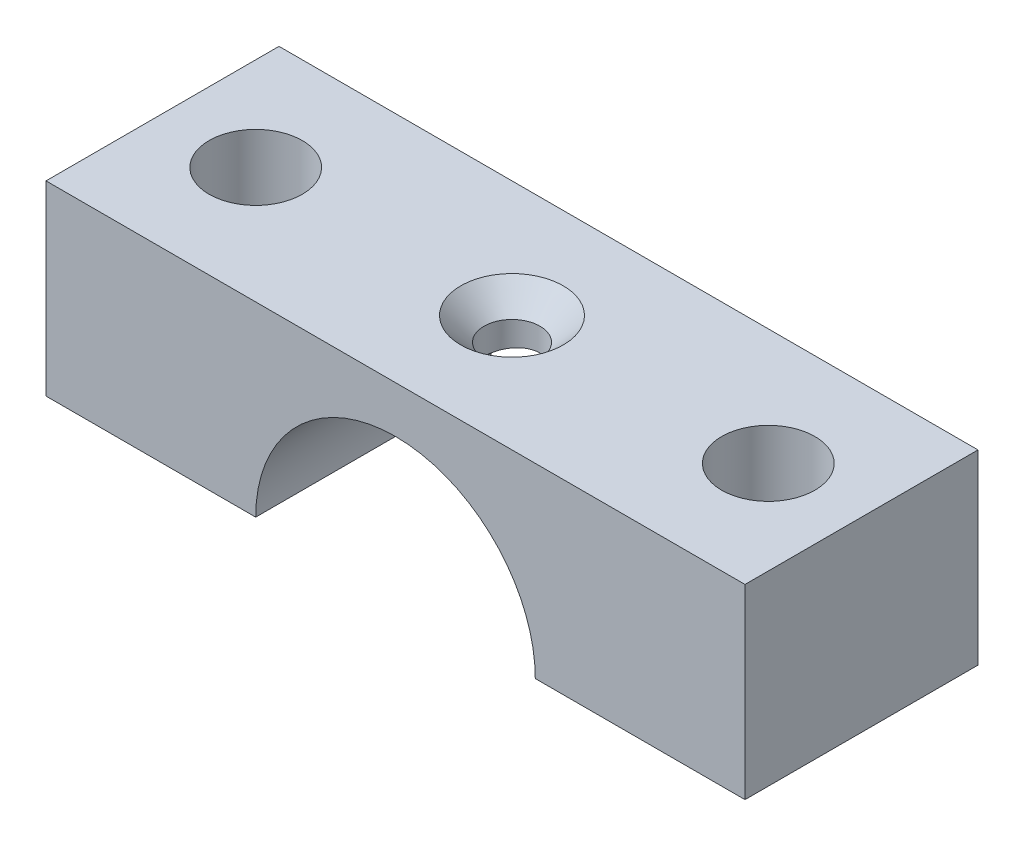
ISO-10303-21;
HEADER;
FILE_DESCRIPTION(('STEP AP214'),'2;1');
FILE_NAME('part.step','',(''),(''),'','','');
FILE_SCHEMA(('AUTOMOTIVE_DESIGN { 1 0 10303 214 1 1 1 1 }'));
ENDSEC;
DATA;
#1=APPLICATION_CONTEXT('core data for automotive mechanical design processes');
#2=APPLICATION_PROTOCOL_DEFINITION('international standard','automotive_design',2000,#1);
#3=PRODUCT_CONTEXT('',#1,'mechanical');
#4=PRODUCT('Part','Part','',(#3));
#5=PRODUCT_RELATED_PRODUCT_CATEGORY('part','',(#4));
#6=PRODUCT_DEFINITION_FORMATION('','',#4);
#7=PRODUCT_DEFINITION_CONTEXT('part definition',#1,'design');
#8=PRODUCT_DEFINITION('design','',#6,#7);
#9=PRODUCT_DEFINITION_SHAPE('','',#8);
#10=(LENGTH_UNIT() NAMED_UNIT(*) SI_UNIT(.MILLI.,.METRE.));
#11=(NAMED_UNIT(*) PLANE_ANGLE_UNIT() SI_UNIT($,.RADIAN.));
#12=(NAMED_UNIT(*) SI_UNIT($,.STERADIAN.) SOLID_ANGLE_UNIT());
#13=UNCERTAINTY_MEASURE_WITH_UNIT(LENGTH_MEASURE(1.E-05),#10,'distance_accuracy_value','');
#14=(GEOMETRIC_REPRESENTATION_CONTEXT(3) GLOBAL_UNCERTAINTY_ASSIGNED_CONTEXT((#13)) GLOBAL_UNIT_ASSIGNED_CONTEXT((#10,
#11,#12)) REPRESENTATION_CONTEXT('',''));
#15=CARTESIAN_POINT('',(0.,0.,0.));
#16=DIRECTION('',(0.,0.,1.));
#17=DIRECTION('',(1.,0.,0.));
#18=AXIS2_PLACEMENT_3D('',#15,#16,#17);
#19=CARTESIAN_POINT('',(0.,0.,5.));
#20=DIRECTION('',(0.,0.,-1.));
#21=DIRECTION('',(-1.,0.,0.));
#22=AXIS2_PLACEMENT_3D('',#19,#20,#21);
#23=CYLINDRICAL_SURFACE('',#22,6.);
#24=CARTESIAN_POINT('',(0.,6.,1.2));
#25=CARTESIAN_POINT('',(0.0666922881511597,5.99999877097045,1.19999754660198));
#26=CARTESIAN_POINT('',(0.133415592241827,5.99887662213877,1.19442138843882));
#27=CARTESIAN_POINT('',(0.264976209226823,5.99450838747878,1.1722817998617));
#28=CARTESIAN_POINT('',(0.329811981049627,5.99126061432223,1.15570964063819));
#29=CARTESIAN_POINT('',(0.455676366315975,5.98300379133944,1.11211047165505));
#30=CARTESIAN_POINT('',(0.51670856151976,5.97799642892062,1.08509347578637));
#31=CARTESIAN_POINT('',(0.63336958663707,5.96676477642377,1.02140130298645));
#32=CARTESIAN_POINT('',(0.688998738090973,5.96054055882848,0.984726701271352));
#33=CARTESIAN_POINT('',(0.794032172777837,5.94746598395964,0.902233806850278));
#34=CARTESIAN_POINT('',(0.843352741390228,5.94060894605217,0.856309973530556));
#35=CARTESIAN_POINT('',(0.933644107929632,5.92709016543106,0.756849100329956));
#36=CARTESIAN_POINT('',(0.974614253724508,5.92042843800509,0.703311466397857));
#37=CARTESIAN_POINT('',(1.04739810401714,5.90798930175138,0.589540568385749));
#38=CARTESIAN_POINT('',(1.07912512663904,5.90222048837935,0.529250827444368));
#39=CARTESIAN_POINT('',(1.13196679989637,5.89231521670101,0.404061817195104));
#40=CARTESIAN_POINT('',(1.15308249892468,5.88817859714354,0.339163003984385));
#41=CARTESIAN_POINT('',(1.18383035986179,5.88207366302646,0.207498763310499));
#42=CARTESIAN_POINT('',(1.19360939755053,5.88007764128625,0.140768947029328));
#43=CARTESIAN_POINT('',(1.20186255327134,5.87839650072753,0.00658821436278886));
#44=CARTESIAN_POINT('',(1.2003378272562,5.87871114561409,-0.0608626275841745));
#45=CARTESIAN_POINT('',(1.18614548772218,5.88159061377822,-0.193496145625204));
#46=CARTESIAN_POINT('',(1.17364624829269,5.88412143430516,-0.258697686752777));
#47=CARTESIAN_POINT('',(1.13812546154766,5.89109455392001,-0.386059291995602));
#48=CARTESIAN_POINT('',(1.11510341172082,5.89553694429335,-0.448219210702809));
#49=CARTESIAN_POINT('',(1.05902974040966,5.9058674220049,-0.568218314044319));
#50=CARTESIAN_POINT('',(1.02591138147854,5.91176507776445,-0.626025455483006));
#51=CARTESIAN_POINT('',(0.950632289487213,5.92433542527674,-0.735325019967376));
#52=CARTESIAN_POINT('',(0.908470517228193,5.93100820606039,-0.786816716221388));
#53=CARTESIAN_POINT('',(0.815399921472699,5.94452425489754,-0.882995282948323));
#54=CARTESIAN_POINT('',(0.764347393454932,5.95136843053086,-0.927543081430956));
#55=CARTESIAN_POINT('',(0.65542202887441,5.9643461845729,-1.00746461556147));
#56=CARTESIAN_POINT('',(0.597549104855265,5.97047975386768,-1.04283823355229));
#57=CARTESIAN_POINT('',(0.476471264254703,5.98136028193065,-1.10343301107117));
#58=CARTESIAN_POINT('',(0.413258183502359,5.98610506617926,-1.12863827237344));
#59=CARTESIAN_POINT('',(0.283378771738397,5.9936569078543,-1.16803256884628));
#60=CARTESIAN_POINT('',(0.216712860086938,5.99646420000638,-1.18222293848835));
#61=CARTESIAN_POINT('',(0.0830152867525798,5.99979206240241,-1.19898774455313));
#62=CARTESIAN_POINT('',(0.0160083939906909,6.00035009582964,-1.20175250344832));
#63=CARTESIAN_POINT('',(-0.117509921031257,5.99922062316123,-1.19610016926938));
#64=CARTESIAN_POINT('',(-0.184021370932552,5.99753324329735,-1.18768370477688));
#65=CARTESIAN_POINT('',(-0.314046791935849,5.99212598409621,-1.16006595174725));
#66=CARTESIAN_POINT('',(-0.377582338007884,5.98842451685048,-1.14096231780251));
#67=CARTESIAN_POINT('',(-0.5005483529996,5.97940262473239,-1.09261922081303));
#68=CARTESIAN_POINT('',(-0.559978513965047,5.97408207857072,-1.0633789983878));
#69=CARTESIAN_POINT('',(-0.673849408423461,5.96231893839953,-0.995181011218423));
#70=CARTESIAN_POINT('',(-0.728220152102625,5.95586340524462,-0.956108662753264));
#71=CARTESIAN_POINT('',(-0.829701622943047,5.94257681795859,-0.869508970551261));
#72=CARTESIAN_POINT('',(-0.876811570716914,5.93574572362066,-0.821980720320158));
#73=CARTESIAN_POINT('',(-0.96316870892901,5.92235164268358,-0.71895197773065));
#74=CARTESIAN_POINT('',(-1.00228524293839,5.91579432279965,-0.663341106934394));
#75=CARTESIAN_POINT('',(-1.07062250406145,5.90381030155433,-0.546226366371984));
#76=CARTESIAN_POINT('',(-1.09984362710748,5.89838355496011,-0.484722732511736));
#77=CARTESIAN_POINT('',(-1.14738220989835,5.8893208870126,-0.357878104620541));
#78=CARTESIAN_POINT('',(-1.16575619974926,5.88567569846624,-0.292558990547616));
#79=CARTESIAN_POINT('',(-1.19125038195263,5.8805692415043,-0.159679855810914));
#80=CARTESIAN_POINT('',(-1.19837204187013,5.87910768829334,-0.0921201285487826));
#81=CARTESIAN_POINT('',(-1.20110509304096,5.87854979557655,0.0420106374531827));
#82=CARTESIAN_POINT('',(-1.19692294568507,5.87941103027161,0.108577378712411));
#83=CARTESIAN_POINT('',(-1.17762276492007,5.88330688181537,0.240037979886032));
#84=CARTESIAN_POINT('',(-1.16250481935516,5.88634148120603,0.304931853233766));
#85=CARTESIAN_POINT('',(-1.12185428219874,5.8942231706299,0.431073253488654));
#86=CARTESIAN_POINT('',(-1.09634700806081,5.89906585222597,0.492329232602898));
#87=CARTESIAN_POINT('',(-1.03566557352192,5.91002057969004,0.609724464881329));
#88=CARTESIAN_POINT('',(-1.00049060252986,5.91613273198673,0.665863288470164));
#89=CARTESIAN_POINT('',(-0.920767097743695,5.9290675262787,0.772458686580376));
#90=CARTESIAN_POINT('',(-0.876069464682215,5.93590047491639,0.822802518321114));
#91=CARTESIAN_POINT('',(-0.778877242815767,5.94943298246346,0.915343446635004));
#92=CARTESIAN_POINT('',(-0.726380864584001,5.95613251035821,0.957538668380726));
#93=CARTESIAN_POINT('',(-0.614421154905894,5.96872598865566,1.03300157273574));
#94=CARTESIAN_POINT('',(-0.5548906613158,5.97461077463095,1.06617120393603));
#95=CARTESIAN_POINT('',(-0.430999633128878,5.98482150102,1.12198334711591));
#96=CARTESIAN_POINT('',(-0.36664351303575,5.98914884566339,1.14463534743899));
#97=CARTESIAN_POINT('',(-0.251785786708535,5.99491647114445,1.17438233765366));
#98=CARTESIAN_POINT('',(-0.201937996816541,5.99681163790142,1.18397183244931));
#99=CARTESIAN_POINT('',(-0.10139943025208,5.99935384967871,1.19678149483004));
#100=CARTESIAN_POINT('',(-0.0507086804983425,6.00000093447786,1.20000186541172));
#101=CARTESIAN_POINT('',(0.,6.,1.2));
#102=B_SPLINE_CURVE_WITH_KNOTS('',3,(#24,#25,#26,#27,#28,#29,#30,#31,#32,#33,#34,#35,#36,#37,
#38,#39,#40,#41,#42,#43,#44,#45,#46,#47,#48,#49,#50,#51,#52,#53,#54,#55,#56,#57,#58,#59,#60,#61,
#62,#63,#64,#65,#66,#67,#68,#69,#70,#71,#72,#73,#74,#75,#76,#77,#78,#79,#80,#81,#82,#83,#84,#85,
#86,#87,#88,#89,#90,#91,#92,#93,#94,#95,#96,#97,#98,#99,#100,#101),.UNSPECIFIED.,.T.,.F.,(4,2,2,
2,2,2,2,2,2,2,2,2,2,2,2,2,2,2,2,2,2,2,2,2,2,2,2,2,2,2,2,2,2,2,2,2,2,2,4),(0.,0.19989135679351,
0.399941580829587,0.599800482300409,0.799647482677035,1.00191920413462,1.20420671609684,
1.40833434007107,1.61244179238237,1.81387422124305,2.0152860513747,2.21366072407534,
2.41204487104475,2.61176988244311,2.81151785699604,3.01485902989621,3.21820281047784,
3.42186329824828,3.62549910837643,3.82572882811518,4.02594729189441,4.22436544740868,
4.42279847059226,4.6236607924003,4.82454466015115,5.0284875429507,5.23242226468159,
5.43528457239267,5.63812041996497,5.83727667081241,6.03643132191129,6.23510353503731,
6.43379241098239,6.63585691486971,6.83796785439516,7.04219396010763,7.24623546621021,
7.39822530347872,7.55021029645194),.UNSPECIFIED.);
#103=CARTESIAN_POINT('',(0.,6.,1.2));
#104=VERTEX_POINT('',#103);
#105=EDGE_CURVE('E41',#104,#104,#102,.T.);
#106=ORIENTED_EDGE('',*,*,#105,.T.);
#107=EDGE_LOOP('',(#106));
#108=FACE_BOUND('',#107,.T.);
#109=CARTESIAN_POINT('',(0.,0.,-5.));
#110=DIRECTION('',(0.,0.,-1.));
#111=DIRECTION('',(-1.,0.,0.));
#112=AXIS2_PLACEMENT_3D('',#109,#110,#111);
#113=CIRCLE('',#112,6.);
#114=CARTESIAN_POINT('',(-6.,0.,-5.));
#115=VERTEX_POINT('',#114);
#116=CARTESIAN_POINT('',(6.,0.,-5.));
#117=VERTEX_POINT('',#116);
#118=EDGE_CURVE('E127',#115,#117,#113,.T.);
#119=ORIENTED_EDGE('',*,*,#118,.T.);
#120=DIRECTION('',(0.,0.,-1.));
#121=VECTOR('',#120,1.);
#122=CARTESIAN_POINT('',(6.,0.,5.));
#123=LINE('',#122,#121);
#124=CARTESIAN_POINT('',(6.,0.,5.));
#125=VERTEX_POINT('',#124);
#126=EDGE_CURVE('E11',#125,#117,#123,.T.);
#127=ORIENTED_EDGE('',*,*,#126,.F.);
#128=CARTESIAN_POINT('',(0.,0.,5.));
#129=DIRECTION('',(0.,0.,-1.));
#130=DIRECTION('',(-1.,0.,0.));
#131=AXIS2_PLACEMENT_3D('',#128,#129,#130);
#132=CIRCLE('',#131,6.);
#133=CARTESIAN_POINT('',(-6.,0.,5.));
#134=VERTEX_POINT('',#133);
#135=EDGE_CURVE('E138',#134,#125,#132,.T.);
#136=ORIENTED_EDGE('',*,*,#135,.F.);
#137=DIRECTION('',(0.,0.,-1.));
#138=VECTOR('',#137,1.);
#139=CARTESIAN_POINT('',(-6.,0.,5.));
#140=LINE('',#139,#138);
#141=EDGE_CURVE('E123',#134,#115,#140,.T.);
#142=ORIENTED_EDGE('',*,*,#141,.T.);
#143=EDGE_LOOP('',(#119,#127,#136,#142));
#144=FACE_BOUND('',#143,.T.);
#145=ADVANCED_FACE('F37',(#108,#144),#23,.F.);
#146=CARTESIAN_POINT('',(15.,0.,5.));
#147=DIRECTION('',(0.,1.,0.));
#148=DIRECTION('',(-1.,0.,0.));
#149=AXIS2_PLACEMENT_3D('',#146,#147,#148);
#150=PLANE('',#149);
#151=CARTESIAN_POINT('',(11.,0.,0.));
#152=DIRECTION('',(0.,1.,0.));
#153=DIRECTION('',(0.,0.,1.));
#154=AXIS2_PLACEMENT_3D('',#151,#152,#153);
#155=CIRCLE('',#154,2.);
#156=CARTESIAN_POINT('',(11.,0.,2.));
#157=VERTEX_POINT('',#156);
#158=EDGE_CURVE('E177',#157,#157,#155,.T.);
#159=ORIENTED_EDGE('',*,*,#158,.T.);
#160=EDGE_LOOP('',(#159));
#161=FACE_BOUND('',#160,.T.);
#162=DIRECTION('',(1.,0.,0.));
#163=VECTOR('',#162,1.);
#164=CARTESIAN_POINT('',(15.,0.,-5.));
#165=LINE('',#164,#163);
#166=CARTESIAN_POINT('',(15.,0.,-5.));
#167=VERTEX_POINT('',#166);
#168=EDGE_CURVE('E130',#117,#167,#165,.T.);
#169=ORIENTED_EDGE('',*,*,#168,.T.);
#170=DIRECTION('',(0.,0.,-1.));
#171=VECTOR('',#170,1.);
#172=CARTESIAN_POINT('',(15.,0.,5.));
#173=LINE('',#172,#171);
#174=CARTESIAN_POINT('',(15.,0.,5.));
#175=VERTEX_POINT('',#174);
#176=EDGE_CURVE('E51',#175,#167,#173,.T.);
#177=ORIENTED_EDGE('',*,*,#176,.F.);
#178=DIRECTION('',(1.,0.,0.));
#179=VECTOR('',#178,1.);
#180=CARTESIAN_POINT('',(15.,0.,5.));
#181=LINE('',#180,#179);
#182=EDGE_CURVE('E96',#125,#175,#181,.T.);
#183=ORIENTED_EDGE('',*,*,#182,.F.);
#184=ORIENTED_EDGE('',*,*,#126,.T.);
#185=EDGE_LOOP('',(#169,#177,#183,#184));
#186=FACE_BOUND('',#185,.T.);
#187=ADVANCED_FACE('F165',(#161,#186),#150,.F.);
#188=CARTESIAN_POINT('',(15.,8.,5.));
#189=DIRECTION('',(-1.,0.,0.));
#190=DIRECTION('',(0.,0.,1.));
#191=AXIS2_PLACEMENT_3D('',#188,#189,#190);
#192=PLANE('',#191);
#193=DIRECTION('',(0.,1.,0.));
#194=VECTOR('',#193,1.);
#195=CARTESIAN_POINT('',(15.,8.,-5.));
#196=LINE('',#195,#194);
#197=CARTESIAN_POINT('',(15.,8.,-5.));
#198=VERTEX_POINT('',#197);
#199=EDGE_CURVE('E133',#167,#198,#196,.T.);
#200=ORIENTED_EDGE('',*,*,#199,.T.);
#201=DIRECTION('',(0.,0.,-1.));
#202=VECTOR('',#201,1.);
#203=CARTESIAN_POINT('',(15.,8.,5.));
#204=LINE('',#203,#202);
#205=CARTESIAN_POINT('',(15.,8.,5.));
#206=VERTEX_POINT('',#205);
#207=EDGE_CURVE('E118',#206,#198,#204,.T.);
#208=ORIENTED_EDGE('',*,*,#207,.F.);
#209=DIRECTION('',(0.,1.,0.));
#210=VECTOR('',#209,1.);
#211=CARTESIAN_POINT('',(15.,8.,5.));
#212=LINE('',#211,#210);
#213=EDGE_CURVE('E109',#175,#206,#212,.T.);
#214=ORIENTED_EDGE('',*,*,#213,.F.);
#215=ORIENTED_EDGE('',*,*,#176,.T.);
#216=EDGE_LOOP('',(#200,#208,#214,#215));
#217=FACE_BOUND('',#216,.T.);
#218=ADVANCED_FACE('F145',(#217),#192,.F.);
#219=CARTESIAN_POINT('',(-15.,8.,5.));
#220=DIRECTION('',(0.,-1.,0.));
#221=DIRECTION('',(0.,0.,-1.));
#222=AXIS2_PLACEMENT_3D('',#219,#220,#221);
#223=PLANE('',#222);
#224=CARTESIAN_POINT('',(0.,8.,0.));
#225=DIRECTION('',(0.,1.,0.));
#226=DIRECTION('',(0.,0.,1.));
#227=AXIS2_PLACEMENT_3D('',#224,#225,#226);
#228=CIRCLE('',#227,2.2);
#229=CARTESIAN_POINT('',(0.,8.,2.2));
#230=VERTEX_POINT('',#229);
#231=EDGE_CURVE('E180',#230,#230,#228,.T.);
#232=ORIENTED_EDGE('',*,*,#231,.F.);
#233=EDGE_LOOP('',(#232));
#234=FACE_BOUND('',#233,.T.);
#235=CARTESIAN_POINT('',(-11.,8.,0.));
#236=DIRECTION('',(0.,1.,0.));
#237=DIRECTION('',(0.,0.,1.));
#238=AXIS2_PLACEMENT_3D('',#235,#236,#237);
#239=CIRCLE('',#238,2.);
#240=CARTESIAN_POINT('',(-11.,8.,2.));
#241=VERTEX_POINT('',#240);
#242=EDGE_CURVE('E188',#241,#241,#239,.T.);
#243=ORIENTED_EDGE('',*,*,#242,.F.);
#244=EDGE_LOOP('',(#243));
#245=FACE_BOUND('',#244,.T.);
#246=CARTESIAN_POINT('',(11.,8.,0.));
#247=DIRECTION('',(0.,1.,0.));
#248=DIRECTION('',(0.,0.,1.));
#249=AXIS2_PLACEMENT_3D('',#246,#247,#248);
#250=CIRCLE('',#249,2.);
#251=CARTESIAN_POINT('',(11.,8.,2.));
#252=VERTEX_POINT('',#251);
#253=EDGE_CURVE('E174',#252,#252,#250,.T.);
#254=ORIENTED_EDGE('',*,*,#253,.F.);
#255=EDGE_LOOP('',(#254));
#256=FACE_BOUND('',#255,.T.);
#257=DIRECTION('',(-1.,0.,0.));
#258=VECTOR('',#257,1.);
#259=CARTESIAN_POINT('',(-15.,8.,-5.));
#260=LINE('',#259,#258);
#261=CARTESIAN_POINT('',(-15.,8.,-5.));
#262=VERTEX_POINT('',#261);
#263=EDGE_CURVE('E117',#198,#262,#260,.T.);
#264=ORIENTED_EDGE('',*,*,#263,.T.);
#265=DIRECTION('',(0.,0.,-1.));
#266=VECTOR('',#265,1.);
#267=CARTESIAN_POINT('',(-15.,8.,5.));
#268=LINE('',#267,#266);
#269=CARTESIAN_POINT('',(-15.,8.,5.));
#270=VERTEX_POINT('',#269);
#271=EDGE_CURVE('E114',#270,#262,#268,.T.);
#272=ORIENTED_EDGE('',*,*,#271,.F.);
#273=DIRECTION('',(-1.,0.,0.));
#274=VECTOR('',#273,1.);
#275=CARTESIAN_POINT('',(-15.,8.,5.));
#276=LINE('',#275,#274);
#277=EDGE_CURVE('E103',#206,#270,#276,.T.);
#278=ORIENTED_EDGE('',*,*,#277,.F.);
#279=ORIENTED_EDGE('',*,*,#207,.T.);
#280=EDGE_LOOP('',(#264,#272,#278,#279));
#281=FACE_BOUND('',#280,.T.);
#282=ADVANCED_FACE('F115',(#234,#245,#256,#281),#223,.F.);
#283=CARTESIAN_POINT('',(-15.,0.,5.));
#284=DIRECTION('',(1.,0.,0.));
#285=DIRECTION('',(0.,0.,-1.));
#286=AXIS2_PLACEMENT_3D('',#283,#284,#285);
#287=PLANE('',#286);
#288=DIRECTION('',(0.,-1.,0.));
#289=VECTOR('',#288,1.);
#290=CARTESIAN_POINT('',(-15.,0.,-5.));
#291=LINE('',#290,#289);
#292=CARTESIAN_POINT('',(-15.,0.,-5.));
#293=VERTEX_POINT('',#292);
#294=EDGE_CURVE('E82',#262,#293,#291,.T.);
#295=ORIENTED_EDGE('',*,*,#294,.T.);
#296=DIRECTION('',(0.,0.,-1.));
#297=VECTOR('',#296,1.);
#298=CARTESIAN_POINT('',(-15.,0.,5.));
#299=LINE('',#298,#297);
#300=CARTESIAN_POINT('',(-15.,0.,5.));
#301=VERTEX_POINT('',#300);
#302=EDGE_CURVE('E119',#301,#293,#299,.T.);
#303=ORIENTED_EDGE('',*,*,#302,.F.);
#304=DIRECTION('',(0.,-1.,0.));
#305=VECTOR('',#304,1.);
#306=CARTESIAN_POINT('',(-15.,0.,5.));
#307=LINE('',#306,#305);
#308=EDGE_CURVE('E107',#270,#301,#307,.T.);
#309=ORIENTED_EDGE('',*,*,#308,.F.);
#310=ORIENTED_EDGE('',*,*,#271,.T.);
#311=EDGE_LOOP('',(#295,#303,#309,#310));
#312=FACE_BOUND('',#311,.T.);
#313=ADVANCED_FACE('F121',(#312),#287,.F.);
#314=CARTESIAN_POINT('',(-6.,0.,5.));
#315=DIRECTION('',(0.,1.,0.));
#316=DIRECTION('',(-1.,0.,0.));
#317=AXIS2_PLACEMENT_3D('',#314,#315,#316);
#318=PLANE('',#317);
#319=CARTESIAN_POINT('',(-11.,0.,0.));
#320=DIRECTION('',(0.,1.,0.));
#321=DIRECTION('',(0.,0.,1.));
#322=AXIS2_PLACEMENT_3D('',#319,#320,#321);
#323=CIRCLE('',#322,2.);
#324=CARTESIAN_POINT('',(-11.,0.,2.));
#325=VERTEX_POINT('',#324);
#326=EDGE_CURVE('E131',#325,#325,#323,.T.);
#327=ORIENTED_EDGE('',*,*,#326,.T.);
#328=EDGE_LOOP('',(#327));
#329=FACE_BOUND('',#328,.T.);
#330=DIRECTION('',(1.,0.,0.));
#331=VECTOR('',#330,1.);
#332=CARTESIAN_POINT('',(-6.,0.,-5.));
#333=LINE('',#332,#331);
#334=EDGE_CURVE('E88',#293,#115,#333,.T.);
#335=ORIENTED_EDGE('',*,*,#334,.T.);
#336=ORIENTED_EDGE('',*,*,#141,.F.);
#337=DIRECTION('',(1.,0.,0.));
#338=VECTOR('',#337,1.);
#339=CARTESIAN_POINT('',(-6.,0.,5.));
#340=LINE('',#339,#338);
#341=EDGE_CURVE('E59',#301,#134,#340,.T.);
#342=ORIENTED_EDGE('',*,*,#341,.F.);
#343=ORIENTED_EDGE('',*,*,#302,.T.);
#344=EDGE_LOOP('',(#335,#336,#342,#343));
#345=FACE_BOUND('',#344,.T.);
#346=ADVANCED_FACE('F152',(#329,#345),#318,.F.);
#347=CARTESIAN_POINT('',(0.,0.,5.));
#348=DIRECTION('',(0.,0.,-1.));
#349=DIRECTION('',(-1.,0.,0.));
#350=AXIS2_PLACEMENT_3D('',#347,#348,#349);
#351=PLANE('',#350);
#352=ORIENTED_EDGE('',*,*,#135,.T.);
#353=ORIENTED_EDGE('',*,*,#182,.T.);
#354=ORIENTED_EDGE('',*,*,#213,.T.);
#355=ORIENTED_EDGE('',*,*,#277,.T.);
#356=ORIENTED_EDGE('',*,*,#308,.T.);
#357=ORIENTED_EDGE('',*,*,#341,.T.);
#358=EDGE_LOOP('',(#352,#353,#354,#355,#356,#357));
#359=FACE_BOUND('',#358,.T.);
#360=ADVANCED_FACE('F105',(#359),#351,.F.);
#361=CARTESIAN_POINT('',(0.,0.,-5.));
#362=DIRECTION('',(0.,0.,-1.));
#363=DIRECTION('',(-1.,0.,0.));
#364=AXIS2_PLACEMENT_3D('',#361,#362,#363);
#365=PLANE('',#364);
#366=ORIENTED_EDGE('',*,*,#118,.F.);
#367=ORIENTED_EDGE('',*,*,#334,.F.);
#368=ORIENTED_EDGE('',*,*,#294,.F.);
#369=ORIENTED_EDGE('',*,*,#263,.F.);
#370=ORIENTED_EDGE('',*,*,#199,.F.);
#371=ORIENTED_EDGE('',*,*,#168,.F.);
#372=EDGE_LOOP('',(#366,#367,#368,#369,#370,#371));
#373=FACE_BOUND('',#372,.T.);
#374=ADVANCED_FACE('F148',(#373),#365,.T.);
#375=CARTESIAN_POINT('',(-11.,0.,0.));
#376=DIRECTION('',(0.,1.,0.));
#377=DIRECTION('',(0.,0.,1.));
#378=AXIS2_PLACEMENT_3D('',#375,#376,#377);
#379=CYLINDRICAL_SURFACE('',#378,2.);
#380=ORIENTED_EDGE('',*,*,#326,.F.);
#381=EDGE_LOOP('',(#380));
#382=FACE_BOUND('',#381,.T.);
#383=ORIENTED_EDGE('',*,*,#242,.T.);
#384=EDGE_LOOP('',(#383));
#385=FACE_BOUND('',#384,.T.);
#386=ADVANCED_FACE('F200',(#382,#385),#379,.F.);
#387=CARTESIAN_POINT('',(11.,0.,0.));
#388=DIRECTION('',(0.,1.,0.));
#389=DIRECTION('',(0.,0.,1.));
#390=AXIS2_PLACEMENT_3D('',#387,#388,#389);
#391=CYLINDRICAL_SURFACE('',#390,2.);
#392=ORIENTED_EDGE('',*,*,#158,.F.);
#393=EDGE_LOOP('',(#392));
#394=FACE_BOUND('',#393,.T.);
#395=ORIENTED_EDGE('',*,*,#253,.T.);
#396=EDGE_LOOP('',(#395));
#397=FACE_BOUND('',#396,.T.);
#398=ADVANCED_FACE('F196',(#394,#397),#391,.F.);
#399=CARTESIAN_POINT('',(0.,8.,0.));
#400=DIRECTION('',(0.,1.,0.));
#401=DIRECTION('',(0.,0.,1.));
#402=AXIS2_PLACEMENT_3D('',#399,#400,#401);
#403=CYLINDRICAL_SURFACE('',#402,1.2);
#404=CARTESIAN_POINT('',(0.,7.,0.));
#405=DIRECTION('',(0.,1.,0.));
#406=DIRECTION('',(0.,0.,1.));
#407=AXIS2_PLACEMENT_3D('',#404,#405,#406);
#408=CIRCLE('',#407,1.2);
#409=CARTESIAN_POINT('',(0.,7.,1.2));
#410=VERTEX_POINT('',#409);
#411=EDGE_CURVE('E175',#410,#410,#408,.T.);
#412=ORIENTED_EDGE('',*,*,#411,.T.);
#413=EDGE_LOOP('',(#412));
#414=FACE_BOUND('',#413,.T.);
#415=ORIENTED_EDGE('',*,*,#105,.F.);
#416=EDGE_LOOP('',(#415));
#417=FACE_BOUND('',#416,.T.);
#418=ADVANCED_FACE('F199',(#414,#417),#403,.F.);
#419=CARTESIAN_POINT('',(0.,8.,0.));
#420=DIRECTION('',(0.,1.,0.));
#421=DIRECTION('',(0.,0.,1.));
#422=AXIS2_PLACEMENT_3D('',#419,#420,#421);
#423=CONICAL_SURFACE('',#422,2.2,0.785398163397449);
#424=ORIENTED_EDGE('',*,*,#411,.F.);
#425=EDGE_LOOP('',(#424));
#426=FACE_BOUND('',#425,.T.);
#427=ORIENTED_EDGE('',*,*,#231,.T.);
#428=EDGE_LOOP('',(#427));
#429=FACE_BOUND('',#428,.T.);
#430=ADVANCED_FACE('F225',(#426,#429),#423,.F.);
#431=CLOSED_SHELL('',(#145,#187,#218,#282,#313,#346,#360,#374,#386,#398,#418,#430));
#432=MANIFOLD_SOLID_BREP('B2',#431);
#433=ADVANCED_BREP_SHAPE_REPRESENTATION('',(#18,#432),#14);
#434=SHAPE_DEFINITION_REPRESENTATION(#9,#433);
ENDSEC;
END-ISO-10303-21;
